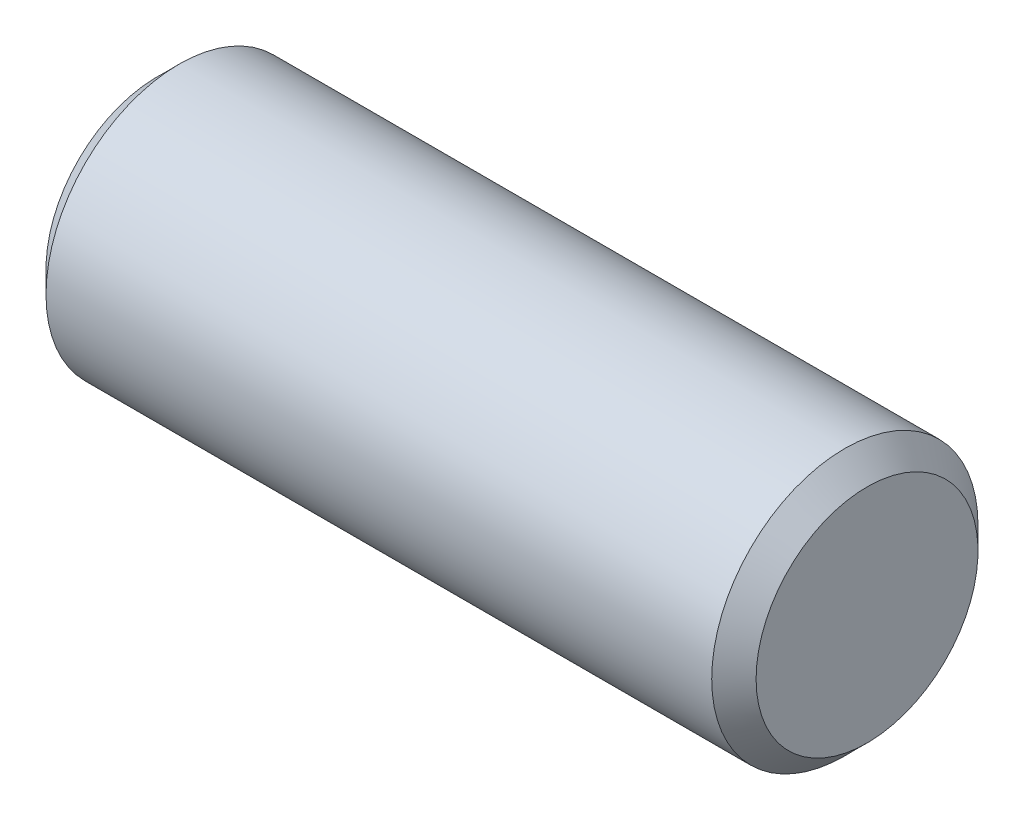
ISO-10303-21;
HEADER;
FILE_DESCRIPTION(('STEP AP214'),'2;1');
FILE_NAME('part.step','',(''),(''),'','','');
FILE_SCHEMA(('AUTOMOTIVE_DESIGN { 1 0 10303 214 1 1 1 1 }'));
ENDSEC;
DATA;
#1=APPLICATION_CONTEXT('core data for automotive mechanical design processes');
#2=APPLICATION_PROTOCOL_DEFINITION('international standard','automotive_design',2000,#1);
#3=PRODUCT_CONTEXT('',#1,'mechanical');
#4=PRODUCT('Part','Part','',(#3));
#5=PRODUCT_RELATED_PRODUCT_CATEGORY('part','',(#4));
#6=PRODUCT_DEFINITION_FORMATION('','',#4);
#7=PRODUCT_DEFINITION_CONTEXT('part definition',#1,'design');
#8=PRODUCT_DEFINITION('design','',#6,#7);
#9=PRODUCT_DEFINITION_SHAPE('','',#8);
#10=(LENGTH_UNIT() NAMED_UNIT(*) SI_UNIT(.MILLI.,.METRE.));
#11=(NAMED_UNIT(*) PLANE_ANGLE_UNIT() SI_UNIT($,.RADIAN.));
#12=(NAMED_UNIT(*) SI_UNIT($,.STERADIAN.) SOLID_ANGLE_UNIT());
#13=UNCERTAINTY_MEASURE_WITH_UNIT(LENGTH_MEASURE(1.E-05),#10,'distance_accuracy_value','');
#14=(GEOMETRIC_REPRESENTATION_CONTEXT(3) GLOBAL_UNCERTAINTY_ASSIGNED_CONTEXT((#13)) GLOBAL_UNIT_ASSIGNED_CONTEXT((#10,
#11,#12)) REPRESENTATION_CONTEXT('',''));
#15=CARTESIAN_POINT('',(0.,0.,0.));
#16=DIRECTION('',(0.,0.,1.));
#17=DIRECTION('',(1.,0.,0.));
#18=AXIS2_PLACEMENT_3D('',#15,#16,#17);
#19=CARTESIAN_POINT('',(25.4,0.,0.));
#20=DIRECTION('',(-1.,0.,0.));
#21=DIRECTION('',(0.,0.,1.));
#22=AXIS2_PLACEMENT_3D('',#19,#20,#21);
#23=CYLINDRICAL_SURFACE('',#22,4.7625);
#24=CARTESIAN_POINT('',(24.60625,0.,0.));
#25=DIRECTION('',(1.,0.,0.));
#26=DIRECTION('',(0.,0.,-1.));
#27=AXIS2_PLACEMENT_3D('',#24,#25,#26);
#28=CIRCLE('',#27,4.7625);
#29=CARTESIAN_POINT('',(24.60625,0.,4.7625));
#30=VERTEX_POINT('',#29);
#31=EDGE_CURVE('E45',#30,#30,#28,.F.);
#32=CARTESIAN_POINT('',(0.793750000000003,0.,0.));
#33=DIRECTION('',(1.,0.,0.));
#34=DIRECTION('',(0.,0.,-1.));
#35=AXIS2_PLACEMENT_3D('',#32,#33,#34);
#36=CIRCLE('',#35,4.7625);
#37=CARTESIAN_POINT('',(0.793750000000003,0.,4.7625));
#38=VERTEX_POINT('',#37);
#39=EDGE_CURVE('E50',#38,#38,#36,.T.);
#40=CARTESIAN_POINT('',(24.60625,0.,4.7625));
#41=CARTESIAN_POINT('',(24.358203125,0.,4.7625));
#42=CARTESIAN_POINT('',(24.11015625,0.,4.7625));
#43=CARTESIAN_POINT('',(23.6140625,0.,4.7625));
#44=CARTESIAN_POINT('',(23.366015625,0.,4.7625));
#45=CARTESIAN_POINT('',(22.869921875,0.,4.7625));
#46=CARTESIAN_POINT('',(22.621875,0.,4.7625));
#47=CARTESIAN_POINT('',(22.12578125,0.,4.7625));
#48=CARTESIAN_POINT('',(21.877734375,0.,4.7625));
#49=CARTESIAN_POINT('',(21.381640625,0.,4.7625));
#50=CARTESIAN_POINT('',(21.13359375,0.,4.7625));
#51=CARTESIAN_POINT('',(20.6375,0.,4.7625));
#52=CARTESIAN_POINT('',(20.389453125,0.,4.7625));
#53=CARTESIAN_POINT('',(19.893359375,0.,4.7625));
#54=CARTESIAN_POINT('',(19.6453125,0.,4.7625));
#55=CARTESIAN_POINT('',(19.14921875,0.,4.7625));
#56=CARTESIAN_POINT('',(18.901171875,0.,4.7625));
#57=CARTESIAN_POINT('',(18.405078125,0.,4.7625));
#58=CARTESIAN_POINT('',(18.15703125,0.,4.7625));
#59=CARTESIAN_POINT('',(17.6609375,0.,4.7625));
#60=CARTESIAN_POINT('',(17.412890625,0.,4.7625));
#61=CARTESIAN_POINT('',(16.916796875,0.,4.7625));
#62=CARTESIAN_POINT('',(16.66875,0.,4.7625));
#63=CARTESIAN_POINT('',(16.17265625,0.,4.7625));
#64=CARTESIAN_POINT('',(15.924609375,0.,4.7625));
#65=CARTESIAN_POINT('',(15.428515625,0.,4.7625));
#66=CARTESIAN_POINT('',(15.18046875,0.,4.7625));
#67=CARTESIAN_POINT('',(14.684375,0.,4.7625));
#68=CARTESIAN_POINT('',(14.436328125,0.,4.7625));
#69=CARTESIAN_POINT('',(13.940234375,0.,4.7625));
#70=CARTESIAN_POINT('',(13.6921875,0.,4.7625));
#71=CARTESIAN_POINT('',(13.19609375,0.,4.7625));
#72=CARTESIAN_POINT('',(12.948046875,0.,4.7625));
#73=CARTESIAN_POINT('',(12.451953125,0.,4.7625));
#74=CARTESIAN_POINT('',(12.20390625,0.,4.7625));
#75=CARTESIAN_POINT('',(11.7078125,0.,4.7625));
#76=CARTESIAN_POINT('',(11.459765625,0.,4.7625));
#77=CARTESIAN_POINT('',(10.963671875,0.,4.7625));
#78=CARTESIAN_POINT('',(10.715625,0.,4.7625));
#79=CARTESIAN_POINT('',(10.21953125,0.,4.7625));
#80=CARTESIAN_POINT('',(9.971484375,0.,4.7625));
#81=CARTESIAN_POINT('',(9.475390625,0.,4.7625));
#82=CARTESIAN_POINT('',(9.22734375,0.,4.7625));
#83=CARTESIAN_POINT('',(8.73125,0.,4.7625));
#84=CARTESIAN_POINT('',(8.483203125,0.,4.7625));
#85=CARTESIAN_POINT('',(7.987109375,0.,4.7625));
#86=CARTESIAN_POINT('',(7.7390625,0.,4.7625));
#87=CARTESIAN_POINT('',(7.24296875,0.,4.7625));
#88=CARTESIAN_POINT('',(6.994921875,0.,4.7625));
#89=CARTESIAN_POINT('',(6.498828125,0.,4.7625));
#90=CARTESIAN_POINT('',(6.25078125,0.,4.7625));
#91=CARTESIAN_POINT('',(5.7546875,0.,4.7625));
#92=CARTESIAN_POINT('',(5.506640625,0.,4.7625));
#93=CARTESIAN_POINT('',(5.010546875,0.,4.7625));
#94=CARTESIAN_POINT('',(4.7625,0.,4.7625));
#95=CARTESIAN_POINT('',(4.26640625,0.,4.7625));
#96=CARTESIAN_POINT('',(4.018359375,0.,4.7625));
#97=CARTESIAN_POINT('',(3.522265625,0.,4.7625));
#98=CARTESIAN_POINT('',(3.27421875,0.,4.7625));
#99=CARTESIAN_POINT('',(2.778125,0.,4.7625));
#100=CARTESIAN_POINT('',(2.530078125,0.,4.7625));
#101=CARTESIAN_POINT('',(2.033984375,0.,4.7625));
#102=CARTESIAN_POINT('',(1.7859375,0.,4.7625));
#103=CARTESIAN_POINT('',(1.28984375,0.,4.7625));
#104=CARTESIAN_POINT('',(1.041796875,0.,4.7625));
#105=CARTESIAN_POINT('',(0.793750000000003,0.,4.7625));
#106=B_SPLINE_CURVE_WITH_KNOTS('',3,(#40,#41,#42,#43,#44,#45,#46,#47,#48,#49,#50,#51,#52,#53,
#54,#55,#56,#57,#58,#59,#60,#61,#62,#63,#64,#65,#66,#67,#68,#69,#70,#71,#72,#73,#74,#75,#76,#77,
#78,#79,#80,#81,#82,#83,#84,#85,#86,#87,#88,#89,#90,#91,#92,#93,#94,#95,#96,#97,#98,#99,#100,
#101,#102,#103,#104,#105),.UNSPECIFIED.,.F.,.F.,(4,2,2,2,2,2,2,2,2,2,2,2,2,2,2,2,2,2,2,2,2,2,2,
2,2,2,2,2,2,2,2,2,4),(0.,0.744140625,1.48828125,2.232421875,2.9765625,3.720703125,4.46484375,
5.208984375,5.953125,6.697265625,7.44140625,8.185546875,8.9296875,9.673828125,10.41796875,
11.162109375,11.90625,12.650390625,13.39453125,14.138671875,14.8828125,15.626953125,16.37109375,
17.115234375,17.859375,18.603515625,19.34765625,20.091796875,20.8359375,21.580078125,
22.32421875,23.068359375,23.8125),.UNSPECIFIED.);
#107=EDGE_CURVE('BSEAM37',#30,#38,#106,.T.);
#108=ORIENTED_EDGE('',*,*,#31,.T.);
#109=ORIENTED_EDGE('',*,*,#39,.T.);
#110=ORIENTED_EDGE('',*,*,#107,.T.);
#111=ORIENTED_EDGE('',*,*,#107,.F.);
#112=EDGE_LOOP('',(#108,#110,#109,#111));
#113=FACE_BOUND('',#112,.T.);
#114=ADVANCED_FACE('F37',(#113),#23,.T.);
#115=CARTESIAN_POINT('',(25.4,0.,0.));
#116=DIRECTION('',(1.,0.,0.));
#117=DIRECTION('',(0.,0.,-1.));
#118=AXIS2_PLACEMENT_3D('',#115,#116,#117);
#119=PLANE('',#118);
#120=CARTESIAN_POINT('',(25.4,0.,0.));
#121=DIRECTION('',(1.,0.,0.));
#122=DIRECTION('',(0.,0.,-1.));
#123=AXIS2_PLACEMENT_3D('',#120,#121,#122);
#124=CIRCLE('',#123,3.96875);
#125=CARTESIAN_POINT('',(25.4,0.,3.96875));
#126=VERTEX_POINT('',#125);
#127=EDGE_CURVE('E55',#126,#126,#124,.T.);
#128=ORIENTED_EDGE('',*,*,#127,.T.);
#129=EDGE_LOOP('',(#128));
#130=FACE_BOUND('',#129,.T.);
#131=ADVANCED_FACE('F62',(#130),#119,.T.);
#132=CARTESIAN_POINT('',(0.,0.,0.));
#133=DIRECTION('',(1.,0.,0.));
#134=DIRECTION('',(0.,0.,-1.));
#135=AXIS2_PLACEMENT_3D('',#132,#133,#134);
#136=PLANE('',#135);
#137=CARTESIAN_POINT('',(0.,0.,0.));
#138=DIRECTION('',(1.,0.,0.));
#139=DIRECTION('',(0.,0.,-1.));
#140=AXIS2_PLACEMENT_3D('',#137,#138,#139);
#141=CIRCLE('',#140,3.96874999999999);
#142=CARTESIAN_POINT('',(0.,0.,-3.96874999999999));
#143=VERTEX_POINT('',#142);
#144=EDGE_CURVE('E10',#143,#143,#141,.F.);
#145=ORIENTED_EDGE('',*,*,#144,.T.);
#146=EDGE_LOOP('',(#145));
#147=FACE_BOUND('',#146,.T.);
#148=ADVANCED_FACE('F66',(#147),#136,.F.);
#149=CARTESIAN_POINT('',(25.4,0.,0.));
#150=DIRECTION('',(-1.,0.,0.));
#151=DIRECTION('',(0.,0.,1.));
#152=AXIS2_PLACEMENT_3D('',#149,#150,#151);
#153=CONICAL_SURFACE('',#152,3.96875,0.785398163397447);
#154=CARTESIAN_POINT('',(24.60625,0.,4.7625));
#155=CARTESIAN_POINT('',(24.6145182291667,0.,4.75423177083333));
#156=CARTESIAN_POINT('',(24.6227864583333,0.,4.74596354166667));
#157=CARTESIAN_POINT('',(24.6393229166667,0.,4.72942708333334));
#158=CARTESIAN_POINT('',(24.6475911458333,0.,4.72115885416667));
#159=CARTESIAN_POINT('',(24.6641276041667,0.,4.70462239583334));
#160=CARTESIAN_POINT('',(24.6723958333333,0.,4.69635416666667));
#161=CARTESIAN_POINT('',(24.6889322916667,0.,4.67981770833334));
#162=CARTESIAN_POINT('',(24.6972005208333,0.,4.67154947916667));
#163=CARTESIAN_POINT('',(24.7137369791667,0.,4.65501302083334));
#164=CARTESIAN_POINT('',(24.7220052083333,0.,4.64674479166667));
#165=CARTESIAN_POINT('',(24.7385416666667,0.,4.63020833333333));
#166=CARTESIAN_POINT('',(24.7468098958333,0.,4.62194010416667));
#167=CARTESIAN_POINT('',(24.7633463541667,0.,4.60540364583334));
#168=CARTESIAN_POINT('',(24.7716145833333,0.,4.59713541666667));
#169=CARTESIAN_POINT('',(24.7881510416667,0.,4.58059895833334));
#170=CARTESIAN_POINT('',(24.7964192708333,0.,4.57233072916667));
#171=CARTESIAN_POINT('',(24.8129557291667,0.,4.55579427083333));
#172=CARTESIAN_POINT('',(24.8212239583333,0.,4.54752604166667));
#173=CARTESIAN_POINT('',(24.8377604166667,0.,4.53098958333334));
#174=CARTESIAN_POINT('',(24.8460286458333,0.,4.52272135416667));
#175=CARTESIAN_POINT('',(24.8625651041667,0.,4.50618489583334));
#176=CARTESIAN_POINT('',(24.8708333333333,0.,4.49791666666667));
#177=CARTESIAN_POINT('',(24.8873697916667,0.,4.48138020833334));
#178=CARTESIAN_POINT('',(24.8956380208333,0.,4.47311197916667));
#179=CARTESIAN_POINT('',(24.9121744791667,0.,4.45657552083334));
#180=CARTESIAN_POINT('',(24.9204427083333,0.,4.44830729166667));
#181=CARTESIAN_POINT('',(24.9369791666667,0.,4.43177083333333));
#182=CARTESIAN_POINT('',(24.9452473958333,0.,4.42350260416667));
#183=CARTESIAN_POINT('',(24.9617838541667,0.,4.40696614583334));
#184=CARTESIAN_POINT('',(24.9700520833333,0.,4.39869791666667));
#185=CARTESIAN_POINT('',(24.9865885416667,0.,4.38216145833334));
#186=CARTESIAN_POINT('',(24.9948567708333,0.,4.37389322916667));
#187=CARTESIAN_POINT('',(25.0113932291667,0.,4.35735677083334));
#188=CARTESIAN_POINT('',(25.0196614583333,0.,4.34908854166667));
#189=CARTESIAN_POINT('',(25.0361979166667,0.,4.33255208333333));
#190=CARTESIAN_POINT('',(25.0444661458333,0.,4.32428385416667));
#191=CARTESIAN_POINT('',(25.0610026041667,0.,4.30774739583334));
#192=CARTESIAN_POINT('',(25.0692708333333,0.,4.29947916666667));
#193=CARTESIAN_POINT('',(25.0858072916667,0.,4.28294270833334));
#194=CARTESIAN_POINT('',(25.0940755208333,0.,4.27467447916667));
#195=CARTESIAN_POINT('',(25.1106119791667,0.,4.25813802083333));
#196=CARTESIAN_POINT('',(25.1188802083333,0.,4.24986979166667));
#197=CARTESIAN_POINT('',(25.1354166666667,0.,4.23333333333334));
#198=CARTESIAN_POINT('',(25.1436848958333,0.,4.22506510416667));
#199=CARTESIAN_POINT('',(25.1602213541667,0.,4.20852864583334));
#200=CARTESIAN_POINT('',(25.1684895833333,0.,4.20026041666667));
#201=CARTESIAN_POINT('',(25.1850260416667,0.,4.18372395833333));
#202=CARTESIAN_POINT('',(25.1932942708333,0.,4.17545572916667));
#203=CARTESIAN_POINT('',(25.2098307291667,0.,4.15891927083334));
#204=CARTESIAN_POINT('',(25.2180989583333,0.,4.15065104166667));
#205=CARTESIAN_POINT('',(25.2346354166667,0.,4.13411458333334));
#206=CARTESIAN_POINT('',(25.2429036458333,0.,4.12584635416667));
#207=CARTESIAN_POINT('',(25.2594401041667,0.,4.10930989583334));
#208=CARTESIAN_POINT('',(25.2677083333333,0.,4.10104166666667));
#209=CARTESIAN_POINT('',(25.2842447916667,0.,4.08450520833334));
#210=CARTESIAN_POINT('',(25.2925130208333,0.,4.07623697916667));
#211=CARTESIAN_POINT('',(25.3090494791667,0.,4.05970052083334));
#212=CARTESIAN_POINT('',(25.3173177083333,0.,4.05143229166667));
#213=CARTESIAN_POINT('',(25.3338541666667,0.,4.03489583333333));
#214=CARTESIAN_POINT('',(25.3421223958333,0.,4.02662760416667));
#215=CARTESIAN_POINT('',(25.3586588541667,0.,4.01009114583334));
#216=CARTESIAN_POINT('',(25.3669270833333,0.,4.00182291666667));
#217=CARTESIAN_POINT('',(25.3834635416667,0.,3.98528645833334));
#218=CARTESIAN_POINT('',(25.3917317708333,0.,3.97701822916667));
#219=CARTESIAN_POINT('',(25.4,0.,3.96875));
#220=B_SPLINE_CURVE_WITH_KNOTS('',3,(#154,#155,#156,#157,#158,#159,#160,#161,#162,#163,#164,
#165,#166,#167,#168,#169,#170,#171,#172,#173,#174,#175,#176,#177,#178,#179,#180,#181,#182,#183,
#184,#185,#186,#187,#188,#189,#190,#191,#192,#193,#194,#195,#196,#197,#198,#199,#200,#201,#202,
#203,#204,#205,#206,#207,#208,#209,#210,#211,#212,#213,#214,#215,#216,#217,#218,#219),
.UNSPECIFIED.,.F.,.F.,(4,2,2,2,2,2,2,2,2,2,2,2,2,2,2,2,2,2,2,2,2,2,2,2,2,2,2,2,2,2,2,2,4),(0.,
0.0350791254729274,0.0701582509458542,0.105237376418782,0.140316501891706,0.175395627364633,
0.210474752837561,0.245553878310485,0.280633003783413,0.31571212925634,0.350791254729264,
0.385870380202192,0.420949505675119,0.456028631148044,0.491107756620971,0.526186882093899,
0.561266007566823,0.59634513303975,0.631424258512678,0.666503383985605,0.70158250945853,
0.736661634931457,0.771740760404384,0.806819885877309,0.841899011350236,0.876978136823163,
0.912057262296088,0.947136387769015,0.982215513241942,1.01729463871487,1.05237376418779,
1.08745288966072,1.12253201513365),.UNSPECIFIED.);
#221=EDGE_CURVE('BSEAM64',#30,#126,#220,.T.);
#222=ORIENTED_EDGE('',*,*,#31,.F.);
#223=ORIENTED_EDGE('',*,*,#127,.F.);
#224=ORIENTED_EDGE('',*,*,#221,.T.);
#225=ORIENTED_EDGE('',*,*,#221,.F.);
#226=EDGE_LOOP('',(#222,#224,#223,#225));
#227=FACE_BOUND('',#226,.T.);
#228=ADVANCED_FACE('F64',(#227),#153,.T.);
#229=CARTESIAN_POINT('',(0.793750000000003,0.,0.));
#230=DIRECTION('',(1.,0.,0.));
#231=DIRECTION('',(0.,0.,-1.));
#232=AXIS2_PLACEMENT_3D('',#229,#230,#231);
#233=CONICAL_SURFACE('',#232,4.7625,0.785398163397451);
#234=ORIENTED_EDGE('',*,*,#144,.F.);
#235=EDGE_LOOP('',(#234));
#236=FACE_BOUND('',#235,.T.);
#237=ORIENTED_EDGE('',*,*,#39,.F.);
#238=EDGE_LOOP('',(#237));
#239=FACE_BOUND('',#238,.T.);
#240=ADVANCED_FACE('F39',(#236,#239),#233,.T.);
#241=CLOSED_SHELL('',(#114,#131,#148,#228,#240));
#242=MANIFOLD_SOLID_BREP('B2',#241);
#243=ADVANCED_BREP_SHAPE_REPRESENTATION('',(#18,#242),#14);
#244=SHAPE_DEFINITION_REPRESENTATION(#9,#243);
ENDSEC;
END-ISO-10303-21;
